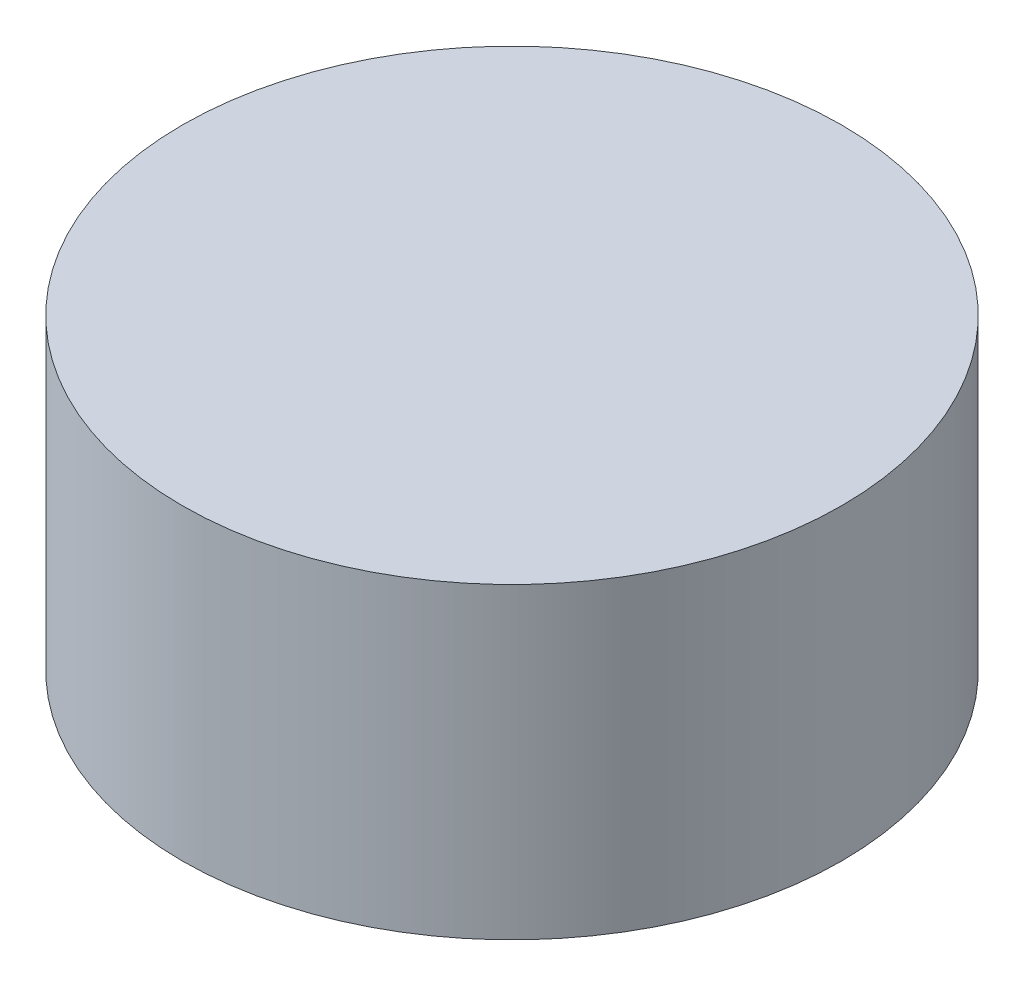
ISO-10303-21;
HEADER;
FILE_DESCRIPTION(('STEP AP214'),'2;1');
FILE_NAME('part.step','',(''),(''),'','','');
FILE_SCHEMA(('AUTOMOTIVE_DESIGN { 1 0 10303 214 1 1 1 1 }'));
ENDSEC;
DATA;
#1=APPLICATION_CONTEXT('core data for automotive mechanical design processes');
#2=APPLICATION_PROTOCOL_DEFINITION('international standard','automotive_design',2000,#1);
#3=PRODUCT_CONTEXT('',#1,'mechanical');
#4=PRODUCT('Part','Part','',(#3));
#5=PRODUCT_RELATED_PRODUCT_CATEGORY('part','',(#4));
#6=PRODUCT_DEFINITION_FORMATION('','',#4);
#7=PRODUCT_DEFINITION_CONTEXT('part definition',#1,'design');
#8=PRODUCT_DEFINITION('design','',#6,#7);
#9=PRODUCT_DEFINITION_SHAPE('','',#8);
#10=(LENGTH_UNIT() NAMED_UNIT(*) SI_UNIT(.MILLI.,.METRE.));
#11=(NAMED_UNIT(*) PLANE_ANGLE_UNIT() SI_UNIT($,.RADIAN.));
#12=(NAMED_UNIT(*) SI_UNIT($,.STERADIAN.) SOLID_ANGLE_UNIT());
#13=UNCERTAINTY_MEASURE_WITH_UNIT(LENGTH_MEASURE(1.E-05),#10,'distance_accuracy_value','');
#14=(GEOMETRIC_REPRESENTATION_CONTEXT(3) GLOBAL_UNCERTAINTY_ASSIGNED_CONTEXT((#13)) GLOBAL_UNIT_ASSIGNED_CONTEXT((#10,
#11,#12)) REPRESENTATION_CONTEXT('',''));
#15=CARTESIAN_POINT('',(0.,0.,0.));
#16=DIRECTION('',(0.,0.,1.));
#17=DIRECTION('',(1.,0.,0.));
#18=AXIS2_PLACEMENT_3D('',#15,#16,#17);
#19=CARTESIAN_POINT('',(-56.9926501468419,8.5,-52.7966768758191));
#20=DIRECTION('',(0.,1.,0.));
#21=DIRECTION('',(0.,0.,1.));
#22=AXIS2_PLACEMENT_3D('',#19,#20,#21);
#23=PLANE('',#22);
#24=CARTESIAN_POINT('',(-56.9926501468419,8.5,-52.7966768758191));
#25=DIRECTION('',(0.,1.,0.));
#26=DIRECTION('',(0.,0.,1.));
#27=AXIS2_PLACEMENT_3D('',#24,#25,#26);
#28=CIRCLE('',#27,7.5);
#29=CARTESIAN_POINT('',(-56.9926501468419,8.5,-45.2966768758191));
#30=VERTEX_POINT('',#29);
#31=EDGE_CURVE('E10',#30,#30,#28,.T.);
#32=ORIENTED_EDGE('',*,*,#31,.T.);
#33=EDGE_LOOP('',(#32));
#34=FACE_BOUND('',#33,.T.);
#35=ADVANCED_FACE('F43',(#34),#23,.T.);
#36=CARTESIAN_POINT('',(-56.9926501468419,8.5,-52.7966768758191));
#37=DIRECTION('',(0.,-1.,0.));
#38=DIRECTION('',(0.,0.,-1.));
#39=AXIS2_PLACEMENT_3D('',#36,#37,#38);
#40=CYLINDRICAL_SURFACE('',#39,7.5);
#41=ORIENTED_EDGE('',*,*,#31,.F.);
#42=EDGE_LOOP('',(#41));
#43=FACE_BOUND('',#42,.T.);
#44=CARTESIAN_POINT('',(-56.9926501468419,1.5,-52.7966768758191));
#45=DIRECTION('',(0.,1.,0.));
#46=DIRECTION('',(0.,0.,1.));
#47=AXIS2_PLACEMENT_3D('',#44,#45,#46);
#48=CIRCLE('',#47,7.5);
#49=CARTESIAN_POINT('',(-56.9926501468419,1.5,-45.2966768758191));
#50=VERTEX_POINT('',#49);
#51=EDGE_CURVE('E50',#50,#50,#48,.T.);
#52=ORIENTED_EDGE('',*,*,#51,.T.);
#53=EDGE_LOOP('',(#52));
#54=FACE_BOUND('',#53,.T.);
#55=ADVANCED_FACE('F45',(#43,#54),#40,.T.);
#56=CARTESIAN_POINT('',(-67.0581943348883,1.5,-64.6517996771633));
#57=DIRECTION('',(0.,1.,0.));
#58=DIRECTION('',(0.,0.,1.));
#59=AXIS2_PLACEMENT_3D('',#56,#57,#58);
#60=PLANE('',#59);
#61=ORIENTED_EDGE('',*,*,#51,.F.);
#62=EDGE_LOOP('',(#61));
#63=FACE_BOUND('',#62,.T.);
#64=ADVANCED_FACE('F57',(#63),#60,.F.);
#65=CLOSED_SHELL('',(#35,#55,#64));
#66=MANIFOLD_SOLID_BREP('B2',#65);
#67=ADVANCED_BREP_SHAPE_REPRESENTATION('',(#18,#66),#14);
#68=SHAPE_DEFINITION_REPRESENTATION(#9,#67);
ENDSEC;
END-ISO-10303-21;
